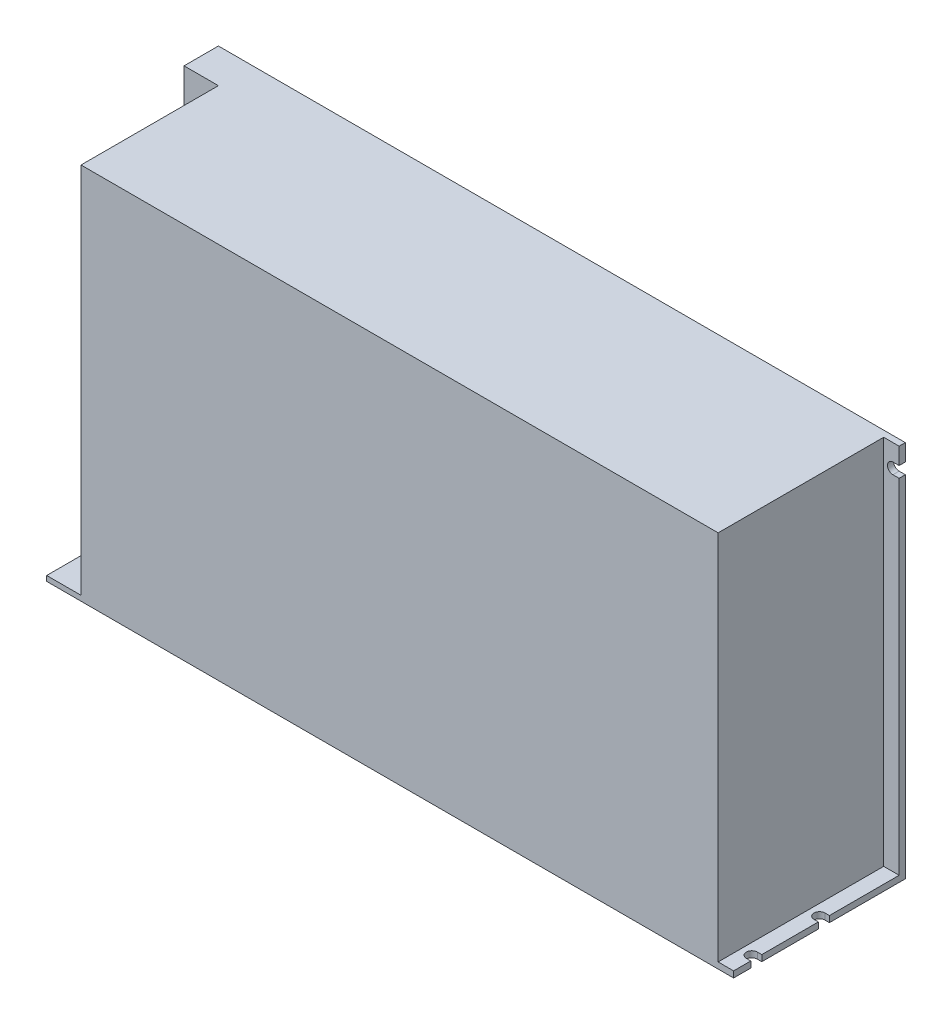
ISO-10303-21;
HEADER;
FILE_DESCRIPTION(('STEP AP214'),'2;1');
FILE_NAME('part.step','',(''),(''),'','','');
FILE_SCHEMA(('AUTOMOTIVE_DESIGN { 1 0 10303 214 1 1 1 1 }'));
ENDSEC;
DATA;
#1=APPLICATION_CONTEXT('core data for automotive mechanical design processes');
#2=APPLICATION_PROTOCOL_DEFINITION('international standard','automotive_design',2000,#1);
#3=PRODUCT_CONTEXT('',#1,'mechanical');
#4=PRODUCT('Part','Part','',(#3));
#5=PRODUCT_RELATED_PRODUCT_CATEGORY('part','',(#4));
#6=PRODUCT_DEFINITION_FORMATION('','',#4);
#7=PRODUCT_DEFINITION_CONTEXT('part definition',#1,'design');
#8=PRODUCT_DEFINITION('design','',#6,#7);
#9=PRODUCT_DEFINITION_SHAPE('','',#8);
#10=(LENGTH_UNIT() NAMED_UNIT(*) SI_UNIT(.MILLI.,.METRE.));
#11=(NAMED_UNIT(*) PLANE_ANGLE_UNIT() SI_UNIT($,.RADIAN.));
#12=(NAMED_UNIT(*) SI_UNIT($,.STERADIAN.) SOLID_ANGLE_UNIT());
#13=UNCERTAINTY_MEASURE_WITH_UNIT(LENGTH_MEASURE(1.E-05),#10,'distance_accuracy_value','');
#14=(GEOMETRIC_REPRESENTATION_CONTEXT(3) GLOBAL_UNCERTAINTY_ASSIGNED_CONTEXT((#13)) GLOBAL_UNIT_ASSIGNED_CONTEXT((#10,
#11,#12)) REPRESENTATION_CONTEXT('',''));
#15=CARTESIAN_POINT('',(0.,0.,0.));
#16=DIRECTION('',(0.,0.,1.));
#17=DIRECTION('',(1.,0.,0.));
#18=AXIS2_PLACEMENT_3D('',#15,#16,#17);
#19=CARTESIAN_POINT('',(77.9667757774141,60.842062193126,50.));
#20=DIRECTION('',(-1.,0.,0.));
#21=DIRECTION('',(0.,0.,1.));
#22=AXIS2_PLACEMENT_3D('',#19,#20,#21);
#23=PLANE('',#22);
#24=DIRECTION('',(0.,1.,0.));
#25=VECTOR('',#24,1.);
#26=CARTESIAN_POINT('',(77.9667757774141,-97.5675442915377,1.8));
#27=LINE('',#26,#25);
#28=CARTESIAN_POINT('',(77.9667757774141,55.942062193126,1.8));
#29=VERTEX_POINT('',#28);
#30=CARTESIAN_POINT('',(77.9667757774141,60.842062193126,1.8));
#31=VERTEX_POINT('',#30);
#32=EDGE_CURVE('E311',#29,#31,#27,.T.);
#33=ORIENTED_EDGE('',*,*,#32,.F.);
#34=DIRECTION('',(0.,0.,-1.));
#35=VECTOR('',#34,1.);
#36=CARTESIAN_POINT('',(77.9667757774141,55.942062193126,1.8));
#37=LINE('',#36,#35);
#38=CARTESIAN_POINT('',(77.9667757774141,55.942062193126,0.));
#39=VERTEX_POINT('',#38);
#40=EDGE_CURVE('E385',#29,#39,#37,.T.);
#41=ORIENTED_EDGE('',*,*,#40,.T.);
#42=DIRECTION('',(0.,1.,0.));
#43=VECTOR('',#42,1.);
#44=CARTESIAN_POINT('',(77.9667757774141,60.842062193126,0.));
#45=LINE('',#44,#43);
#46=CARTESIAN_POINT('',(77.9667757774141,60.842062193126,0.));
#47=VERTEX_POINT('',#46);
#48=EDGE_CURVE('E222',#39,#47,#45,.T.);
#49=ORIENTED_EDGE('',*,*,#48,.T.);
#50=DIRECTION('',(0.,0.,-1.));
#51=VECTOR('',#50,1.);
#52=CARTESIAN_POINT('',(77.9667757774141,60.842062193126,50.));
#53=LINE('',#52,#51);
#54=EDGE_CURVE('E241',#31,#47,#53,.T.);
#55=ORIENTED_EDGE('',*,*,#54,.F.);
#56=EDGE_LOOP('',(#33,#41,#49,#55));
#57=FACE_BOUND('',#56,.T.);
#58=ADVANCED_FACE('F31',(#57),#23,.F.);
#59=DIRECTION('',(0.,0.,-1.));
#60=VECTOR('',#59,1.);
#61=CARTESIAN_POINT('',(77.9667757774141,-49.157937806874,50.));
#62=LINE('',#61,#60);
#63=CARTESIAN_POINT('',(77.9667757774141,-49.157937806874,41.8));
#64=VERTEX_POINT('',#63);
#65=CARTESIAN_POINT('',(77.9667757774141,-49.157937806874,25.3));
#66=VERTEX_POINT('',#65);
#67=EDGE_CURVE('E248',#64,#66,#62,.T.);
#68=ORIENTED_EDGE('',*,*,#67,.T.);
#69=DIRECTION('',(0.,-1.,0.));
#70=VECTOR('',#69,1.);
#71=CARTESIAN_POINT('',(77.9667757774141,-39.157937806874,25.3));
#72=LINE('',#71,#70);
#73=CARTESIAN_POINT('',(77.9667757774141,-47.357937806874,25.3));
#74=VERTEX_POINT('',#73);
#75=EDGE_CURVE('E288',#74,#66,#72,.T.);
#76=ORIENTED_EDGE('',*,*,#75,.F.);
#77=DIRECTION('',(0.,0.,1.));
#78=VECTOR('',#77,1.);
#79=CARTESIAN_POINT('',(77.9667757774141,-47.357937806874,50.));
#80=LINE('',#79,#78);
#81=CARTESIAN_POINT('',(77.9667757774141,-47.357937806874,41.8));
#82=VERTEX_POINT('',#81);
#83=EDGE_CURVE('E293',#74,#82,#80,.T.);
#84=ORIENTED_EDGE('',*,*,#83,.T.);
#85=DIRECTION('',(0.,-1.,0.));
#86=VECTOR('',#85,1.);
#87=CARTESIAN_POINT('',(77.9667757774141,-39.157937806874,41.8));
#88=LINE('',#87,#86);
#89=EDGE_CURVE('E432',#82,#64,#88,.T.);
#90=ORIENTED_EDGE('',*,*,#89,.T.);
#91=EDGE_LOOP('',(#68,#76,#84,#90));
#92=FACE_BOUND('',#91,.T.);
#93=ADVANCED_FACE('F498',(#92),#23,.F.);
#94=CARTESIAN_POINT('',(77.9667757774141,-49.157937806874,50.));
#95=VERTEX_POINT('',#94);
#96=CARTESIAN_POINT('',(77.9667757774141,-49.157937806874,45.));
#97=VERTEX_POINT('',#96);
#98=EDGE_CURVE('E244',#95,#97,#62,.T.);
#99=ORIENTED_EDGE('',*,*,#98,.T.);
#100=DIRECTION('',(0.,-1.,0.));
#101=VECTOR('',#100,1.);
#102=CARTESIAN_POINT('',(77.9667757774141,-39.157937806874,45.));
#103=LINE('',#102,#101);
#104=CARTESIAN_POINT('',(77.9667757774141,-47.357937806874,45.));
#105=VERTEX_POINT('',#104);
#106=EDGE_CURVE('E430',#105,#97,#103,.T.);
#107=ORIENTED_EDGE('',*,*,#106,.F.);
#108=CARTESIAN_POINT('',(77.9667757774141,-47.357937806874,50.));
#109=VERTEX_POINT('',#108);
#110=EDGE_CURVE('E299',#105,#109,#80,.T.);
#111=ORIENTED_EDGE('',*,*,#110,.T.);
#112=DIRECTION('',(0.,1.,0.));
#113=VECTOR('',#112,1.);
#114=CARTESIAN_POINT('',(77.9667757774141,60.842062193126,50.));
#115=LINE('',#114,#113);
#116=EDGE_CURVE('E234',#95,#109,#115,.T.);
#117=ORIENTED_EDGE('',*,*,#116,.F.);
#118=EDGE_LOOP('',(#99,#107,#111,#117));
#119=FACE_BOUND('',#118,.T.);
#120=ADVANCED_FACE('F504',(#119),#23,.F.);
#121=CARTESIAN_POINT('',(-122.033224222586,-49.157937806874,0.));
#122=DIRECTION('',(0.,0.,1.));
#123=DIRECTION('',(1.,0.,0.));
#124=AXIS2_PLACEMENT_3D('',#121,#122,#123);
#125=PLANE('',#124);
#126=CARTESIAN_POINT('',(-118.533224222586,-41.157937806874,0.));
#127=DIRECTION('',(0.,0.,-1.));
#128=DIRECTION('',(-1.,0.,0.));
#129=AXIS2_PLACEMENT_3D('',#126,#127,#128);
#130=CIRCLE('',#129,1.60000000000001);
#131=CARTESIAN_POINT('',(-120.133224222586,-41.157937806874,0.));
#132=VERTEX_POINT('',#131);
#133=EDGE_CURVE('E624',#132,#132,#130,.T.);
#134=ORIENTED_EDGE('',*,*,#133,.F.);
#135=EDGE_LOOP('',(#134));
#136=FACE_BOUND('',#135,.T.);
#137=CARTESIAN_POINT('',(-60.5332242225859,-34.157937806874,0.));
#138=DIRECTION('',(0.,0.,1.));
#139=DIRECTION('',(1.,0.,0.));
#140=AXIS2_PLACEMENT_3D('',#137,#138,#139);
#141=CIRCLE('',#140,2.);
#142=CARTESIAN_POINT('',(-58.5332242225859,-34.157937806874,0.));
#143=VERTEX_POINT('',#142);
#144=EDGE_CURVE('E347',#143,#143,#141,.T.);
#145=ORIENTED_EDGE('',*,*,#144,.T.);
#146=EDGE_LOOP('',(#145));
#147=FACE_BOUND('',#146,.T.);
#148=CARTESIAN_POINT('',(-60.533224222586,50.842062193126,0.));
#149=DIRECTION('',(0.,0.,1.));
#150=DIRECTION('',(1.,0.,0.));
#151=AXIS2_PLACEMENT_3D('',#148,#149,#150);
#152=CIRCLE('',#151,2.);
#153=CARTESIAN_POINT('',(-58.533224222586,50.842062193126,0.));
#154=VERTEX_POINT('',#153);
#155=EDGE_CURVE('E359',#154,#154,#152,.T.);
#156=ORIENTED_EDGE('',*,*,#155,.T.);
#157=EDGE_LOOP('',(#156));
#158=FACE_BOUND('',#157,.T.);
#159=ORIENTED_EDGE('',*,*,#48,.F.);
#160=DIRECTION('',(1.,0.,0.));
#161=VECTOR('',#160,1.);
#162=CARTESIAN_POINT('',(77.9667757774141,55.942062193126,0.));
#163=LINE('',#162,#161);
#164=CARTESIAN_POINT('',(76.1667757774141,55.942062193126,0.));
#165=VERTEX_POINT('',#164);
#166=EDGE_CURVE('E629',#165,#39,#163,.T.);
#167=ORIENTED_EDGE('',*,*,#166,.F.);
#168=CARTESIAN_POINT('',(76.1667757774141,54.342062193126,0.));
#169=DIRECTION('',(0.,0.,-1.));
#170=DIRECTION('',(1.,0.,0.));
#171=AXIS2_PLACEMENT_3D('',#168,#169,#170);
#172=CIRCLE('',#171,1.6);
#173=CARTESIAN_POINT('',(76.1667757774141,52.742062193126,0.));
#174=VERTEX_POINT('',#173);
#175=EDGE_CURVE('E213',#174,#165,#172,.T.);
#176=ORIENTED_EDGE('',*,*,#175,.F.);
#177=DIRECTION('',(-1.,0.,0.));
#178=VECTOR('',#177,1.);
#179=CARTESIAN_POINT('',(77.9667757774141,52.742062193126,0.));
#180=LINE('',#179,#178);
#181=CARTESIAN_POINT('',(77.9667757774141,52.742062193126,0.));
#182=VERTEX_POINT('',#181);
#183=EDGE_CURVE('E194',#182,#174,#180,.T.);
#184=ORIENTED_EDGE('',*,*,#183,.F.);
#185=CARTESIAN_POINT('',(77.9667757774141,-49.157937806874,0.));
#186=VERTEX_POINT('',#185);
#187=EDGE_CURVE('E210',#186,#182,#45,.T.);
#188=ORIENTED_EDGE('',*,*,#187,.F.);
#189=DIRECTION('',(1.,0.,0.));
#190=VECTOR('',#189,1.);
#191=CARTESIAN_POINT('',(-122.033224222586,-49.157937806874,0.));
#192=LINE('',#191,#190);
#193=CARTESIAN_POINT('',(-122.033224222586,-49.157937806874,0.));
#194=VERTEX_POINT('',#193);
#195=EDGE_CURVE('E227',#194,#186,#192,.T.);
#196=ORIENTED_EDGE('',*,*,#195,.F.);
#197=DIRECTION('',(0.,-1.,0.));
#198=VECTOR('',#197,1.);
#199=CARTESIAN_POINT('',(-122.033224222586,60.842062193126,0.));
#200=LINE('',#199,#198);
#201=CARTESIAN_POINT('',(-122.033224222586,60.842062193126,0.));
#202=VERTEX_POINT('',#201);
#203=EDGE_CURVE('E364',#202,#194,#200,.T.);
#204=ORIENTED_EDGE('',*,*,#203,.F.);
#205=DIRECTION('',(-1.,0.,0.));
#206=VECTOR('',#205,1.);
#207=CARTESIAN_POINT('',(-122.033224222586,60.842062193126,0.));
#208=LINE('',#207,#206);
#209=EDGE_CURVE('E221',#47,#202,#208,.T.);
#210=ORIENTED_EDGE('',*,*,#209,.F.);
#211=EDGE_LOOP('',(#159,#167,#176,#184,#188,#196,#204,#210));
#212=FACE_BOUND('',#211,.T.);
#213=CARTESIAN_POINT('',(65.466775777414,50.842062193126,0.));
#214=DIRECTION('',(0.,0.,1.));
#215=DIRECTION('',(1.,0.,0.));
#216=AXIS2_PLACEMENT_3D('',#213,#214,#215);
#217=CIRCLE('',#216,2.);
#218=CARTESIAN_POINT('',(67.466775777414,50.842062193126,0.));
#219=VERTEX_POINT('',#218);
#220=EDGE_CURVE('E353',#219,#219,#217,.T.);
#221=ORIENTED_EDGE('',*,*,#220,.T.);
#222=EDGE_LOOP('',(#221));
#223=FACE_BOUND('',#222,.T.);
#224=CARTESIAN_POINT('',(65.4667757774141,-34.157937806874,0.));
#225=DIRECTION('',(0.,0.,1.));
#226=DIRECTION('',(1.,0.,0.));
#227=AXIS2_PLACEMENT_3D('',#224,#225,#226);
#228=CIRCLE('',#227,2.);
#229=CARTESIAN_POINT('',(67.4667757774141,-34.157937806874,0.));
#230=VERTEX_POINT('',#229);
#231=EDGE_CURVE('E338',#230,#230,#228,.T.);
#232=ORIENTED_EDGE('',*,*,#231,.T.);
#233=EDGE_LOOP('',(#232));
#234=FACE_BOUND('',#233,.T.);
#235=ADVANCED_FACE('F208',(#136,#147,#158,#212,#223,#234),#125,.F.);
#236=CARTESIAN_POINT('',(-122.033224222586,60.842062193126,50.));
#237=DIRECTION('',(1.,0.,0.));
#238=DIRECTION('',(0.,1.,0.));
#239=AXIS2_PLACEMENT_3D('',#236,#237,#238);
#240=PLANE('',#239);
#241=DIRECTION('',(0.,0.,1.));
#242=VECTOR('',#241,1.);
#243=CARTESIAN_POINT('',(-122.033224222586,-47.657937806874,10.));
#244=LINE('',#243,#242);
#245=CARTESIAN_POINT('',(-122.033224222586,-47.657937806874,1.8));
#246=VERTEX_POINT('',#245);
#247=CARTESIAN_POINT('',(-122.033224222586,-47.657937806874,50.));
#248=VERTEX_POINT('',#247);
#249=EDGE_CURVE('E334',#246,#248,#244,.T.);
#250=ORIENTED_EDGE('',*,*,#249,.F.);
#251=DIRECTION('',(0.,1.,0.));
#252=VECTOR('',#251,1.);
#253=CARTESIAN_POINT('',(-122.033224222586,-47.657937806874,1.8));
#254=LINE('',#253,#252);
#255=CARTESIAN_POINT('',(-122.033224222586,-37.657937806874,1.79999999999999));
#256=VERTEX_POINT('',#255);
#257=EDGE_CURVE('E398',#246,#256,#254,.T.);
#258=ORIENTED_EDGE('',*,*,#257,.T.);
#259=DIRECTION('',(0.,0.,1.));
#260=VECTOR('',#259,1.);
#261=CARTESIAN_POINT('',(-122.033224222586,-37.657937806874,-14.142135623731));
#262=LINE('',#261,#260);
#263=CARTESIAN_POINT('',(-122.033224222586,-37.657937806874,10.));
#264=VERTEX_POINT('',#263);
#265=EDGE_CURVE('E402',#256,#264,#262,.T.);
#266=ORIENTED_EDGE('',*,*,#265,.T.);
#267=DIRECTION('',(0.,-1.,0.));
#268=VECTOR('',#267,1.);
#269=CARTESIAN_POINT('',(-122.033224222586,60.842062193126,10.));
#270=LINE('',#269,#268);
#271=CARTESIAN_POINT('',(-122.033224222586,60.842062193126,10.));
#272=VERTEX_POINT('',#271);
#273=EDGE_CURVE('E327',#272,#264,#270,.T.);
#274=ORIENTED_EDGE('',*,*,#273,.F.);
#275=DIRECTION('',(0.,0.,-1.));
#276=VECTOR('',#275,1.);
#277=CARTESIAN_POINT('',(-122.033224222586,60.842062193126,50.));
#278=LINE('',#277,#276);
#279=EDGE_CURVE('E239',#272,#202,#278,.T.);
#280=ORIENTED_EDGE('',*,*,#279,.T.);
#281=ORIENTED_EDGE('',*,*,#203,.T.);
#282=DIRECTION('',(0.,0.,-1.));
#283=VECTOR('',#282,1.);
#284=CARTESIAN_POINT('',(-122.033224222586,-49.157937806874,50.));
#285=LINE('',#284,#283);
#286=CARTESIAN_POINT('',(-122.033224222586,-49.157937806874,50.));
#287=VERTEX_POINT('',#286);
#288=EDGE_CURVE('E247',#287,#194,#285,.T.);
#289=ORIENTED_EDGE('',*,*,#288,.F.);
#290=DIRECTION('',(0.,-1.,0.));
#291=VECTOR('',#290,1.);
#292=CARTESIAN_POINT('',(-122.033224222586,60.842062193126,50.));
#293=LINE('',#292,#291);
#294=EDGE_CURVE('E225',#248,#287,#293,.T.);
#295=ORIENTED_EDGE('',*,*,#294,.F.);
#296=EDGE_LOOP('',(#250,#258,#266,#274,#280,#281,#289,#295));
#297=FACE_BOUND('',#296,.T.);
#298=ADVANCED_FACE('F33',(#297),#240,.F.);
#299=CARTESIAN_POINT('',(-122.033224222586,-49.157937806874,50.));
#300=DIRECTION('',(0.,1.,0.));
#301=DIRECTION('',(0.,0.,1.));
#302=AXIS2_PLACEMENT_3D('',#299,#300,#301);
#303=PLANE('',#302);
#304=CARTESIAN_POINT('',(-116.033224222586,-49.157937806874,33.));
#305=DIRECTION('',(0.,-1.,0.));
#306=DIRECTION('',(0.,0.,-1.));
#307=AXIS2_PLACEMENT_3D('',#304,#305,#306);
#308=CIRCLE('',#307,1.60000000000001);
#309=CARTESIAN_POINT('',(-116.033224222586,-49.157937806874,31.4));
#310=VERTEX_POINT('',#309);
#311=EDGE_CURVE('E261',#310,#310,#308,.T.);
#312=ORIENTED_EDGE('',*,*,#311,.F.);
#313=EDGE_LOOP('',(#312));
#314=FACE_BOUND('',#313,.T.);
#315=CARTESIAN_POINT('',(56.9667757774141,-49.157937806874,38.));
#316=DIRECTION('',(0.,-1.,0.));
#317=DIRECTION('',(0.,0.,-1.));
#318=AXIS2_PLACEMENT_3D('',#315,#316,#317);
#319=CIRCLE('',#318,1.5);
#320=CARTESIAN_POINT('',(56.9667757774141,-49.157937806874,36.5));
#321=VERTEX_POINT('',#320);
#322=EDGE_CURVE('E260',#321,#321,#319,.T.);
#323=ORIENTED_EDGE('',*,*,#322,.F.);
#324=EDGE_LOOP('',(#323));
#325=FACE_BOUND('',#324,.T.);
#326=CARTESIAN_POINT('',(56.9667757774141,-49.157937806874,13.));
#327=DIRECTION('',(0.,-1.,0.));
#328=DIRECTION('',(0.,0.,-1.));
#329=AXIS2_PLACEMENT_3D('',#326,#327,#328);
#330=CIRCLE('',#329,1.5);
#331=CARTESIAN_POINT('',(56.9667757774141,-49.157937806874,11.5));
#332=VERTEX_POINT('',#331);
#333=EDGE_CURVE('E444',#332,#332,#330,.T.);
#334=ORIENTED_EDGE('',*,*,#333,.F.);
#335=EDGE_LOOP('',(#334));
#336=FACE_BOUND('',#335,.T.);
#337=CARTESIAN_POINT('',(-116.033224222586,-49.157937806874,13.));
#338=DIRECTION('',(0.,-1.,0.));
#339=DIRECTION('',(0.,0.,-1.));
#340=AXIS2_PLACEMENT_3D('',#337,#338,#339);
#341=CIRCLE('',#340,1.5);
#342=CARTESIAN_POINT('',(-116.033224222586,-49.157937806874,11.5));
#343=VERTEX_POINT('',#342);
#344=EDGE_CURVE('E256',#343,#343,#341,.T.);
#345=ORIENTED_EDGE('',*,*,#344,.F.);
#346=EDGE_LOOP('',(#345));
#347=FACE_BOUND('',#346,.T.);
#348=CARTESIAN_POINT('',(76.6667757774141,-49.157937806874,23.7));
#349=DIRECTION('',(0.,-1.,0.));
#350=DIRECTION('',(0.,0.,1.));
#351=AXIS2_PLACEMENT_3D('',#348,#349,#350);
#352=CIRCLE('',#351,1.59999999999999);
#353=CARTESIAN_POINT('',(76.6667757774141,-49.157937806874,25.3));
#354=VERTEX_POINT('',#353);
#355=CARTESIAN_POINT('',(76.6667757774141,-49.157937806874,22.1));
#356=VERTEX_POINT('',#355);
#357=EDGE_CURVE('E413',#354,#356,#352,.T.);
#358=ORIENTED_EDGE('',*,*,#357,.F.);
#359=DIRECTION('',(-1.,0.,0.));
#360=VECTOR('',#359,1.);
#361=CARTESIAN_POINT('',(77.9667757774141,-49.157937806874,25.3));
#362=LINE('',#361,#360);
#363=EDGE_CURVE('E285',#66,#354,#362,.T.);
#364=ORIENTED_EDGE('',*,*,#363,.F.);
#365=ORIENTED_EDGE('',*,*,#67,.F.);
#366=DIRECTION('',(1.,0.,0.));
#367=VECTOR('',#366,1.);
#368=CARTESIAN_POINT('',(77.9667757774141,-49.157937806874,41.8));
#369=LINE('',#368,#367);
#370=CARTESIAN_POINT('',(76.6667757774141,-49.157937806874,41.8));
#371=VERTEX_POINT('',#370);
#372=EDGE_CURVE('E427',#371,#64,#369,.T.);
#373=ORIENTED_EDGE('',*,*,#372,.F.);
#374=CARTESIAN_POINT('',(76.6667757774141,-49.157937806874,43.4));
#375=DIRECTION('',(0.,-1.,0.));
#376=DIRECTION('',(0.,0.,-1.));
#377=AXIS2_PLACEMENT_3D('',#374,#375,#376);
#378=CIRCLE('',#377,1.6);
#379=CARTESIAN_POINT('',(76.6667757774141,-49.157937806874,45.));
#380=VERTEX_POINT('',#379);
#381=EDGE_CURVE('E424',#380,#371,#378,.T.);
#382=ORIENTED_EDGE('',*,*,#381,.F.);
#383=DIRECTION('',(-1.,0.,0.));
#384=VECTOR('',#383,1.);
#385=CARTESIAN_POINT('',(77.9667757774141,-49.157937806874,45.));
#386=LINE('',#385,#384);
#387=EDGE_CURVE('E287',#97,#380,#386,.T.);
#388=ORIENTED_EDGE('',*,*,#387,.F.);
#389=ORIENTED_EDGE('',*,*,#98,.F.);
#390=DIRECTION('',(1.,0.,0.));
#391=VECTOR('',#390,1.);
#392=CARTESIAN_POINT('',(-122.033224222586,-49.157937806874,50.));
#393=LINE('',#392,#391);
#394=EDGE_CURVE('E232',#287,#95,#393,.T.);
#395=ORIENTED_EDGE('',*,*,#394,.F.);
#396=ORIENTED_EDGE('',*,*,#288,.T.);
#397=ORIENTED_EDGE('',*,*,#195,.T.);
#398=CARTESIAN_POINT('',(77.9667757774141,-49.157937806874,22.1));
#399=VERTEX_POINT('',#398);
#400=EDGE_CURVE('E219',#399,#186,#62,.T.);
#401=ORIENTED_EDGE('',*,*,#400,.F.);
#402=DIRECTION('',(1.,0.,0.));
#403=VECTOR('',#402,1.);
#404=CARTESIAN_POINT('',(77.9667757774141,-49.157937806874,22.1));
#405=LINE('',#404,#403);
#406=EDGE_CURVE('E415',#356,#399,#405,.T.);
#407=ORIENTED_EDGE('',*,*,#406,.F.);
#408=EDGE_LOOP('',(#358,#364,#365,#373,#382,#388,#389,#395,#396,#397,#401,#407));
#409=FACE_BOUND('',#408,.T.);
#410=ADVANCED_FACE('F370',(#314,#325,#336,#347,#409),#303,.F.);
#411=ORIENTED_EDGE('',*,*,#187,.T.);
#412=DIRECTION('',(0.,0.,-1.));
#413=VECTOR('',#412,1.);
#414=CARTESIAN_POINT('',(77.9667757774141,52.742062193126,1.8));
#415=LINE('',#414,#413);
#416=CARTESIAN_POINT('',(77.9667757774141,52.742062193126,1.8));
#417=VERTEX_POINT('',#416);
#418=EDGE_CURVE('E191',#417,#182,#415,.T.);
#419=ORIENTED_EDGE('',*,*,#418,.F.);
#420=CARTESIAN_POINT('',(77.9667757774141,-47.357937806874,1.8));
#421=VERTEX_POINT('',#420);
#422=EDGE_CURVE('E318',#421,#417,#27,.T.);
#423=ORIENTED_EDGE('',*,*,#422,.F.);
#424=CARTESIAN_POINT('',(77.9667757774141,-47.357937806874,22.1));
#425=VERTEX_POINT('',#424);
#426=EDGE_CURVE('E298',#421,#425,#80,.T.);
#427=ORIENTED_EDGE('',*,*,#426,.T.);
#428=DIRECTION('',(0.,-1.,0.));
#429=VECTOR('',#428,1.);
#430=CARTESIAN_POINT('',(77.9667757774141,-39.157937806874,22.1));
#431=LINE('',#430,#429);
#432=EDGE_CURVE('E419',#425,#399,#431,.T.);
#433=ORIENTED_EDGE('',*,*,#432,.T.);
#434=ORIENTED_EDGE('',*,*,#400,.T.);
#435=EDGE_LOOP('',(#411,#419,#423,#427,#433,#434));
#436=FACE_BOUND('',#435,.T.);
#437=ADVANCED_FACE('F216',(#436),#23,.F.);
#438=CARTESIAN_POINT('',(-122.033224222586,60.842062193126,50.));
#439=DIRECTION('',(0.,-1.,0.));
#440=DIRECTION('',(0.,0.,-1.));
#441=AXIS2_PLACEMENT_3D('',#438,#439,#440);
#442=PLANE('',#441);
#443=DIRECTION('',(-1.,0.,0.));
#444=VECTOR('',#443,1.);
#445=CARTESIAN_POINT('',(-122.033224222586,60.842062193126,50.));
#446=LINE('',#445,#444);
#447=CARTESIAN_POINT('',(73.4667757774141,60.842062193126,50.));
#448=VERTEX_POINT('',#447);
#449=CARTESIAN_POINT('',(-112.033224222586,60.842062193126,50.));
#450=VERTEX_POINT('',#449);
#451=EDGE_CURVE('E237',#448,#450,#446,.T.);
#452=ORIENTED_EDGE('',*,*,#451,.F.);
#453=DIRECTION('',(0.,0.,1.));
#454=VECTOR('',#453,1.);
#455=CARTESIAN_POINT('',(73.4667757774141,60.842062193126,50.));
#456=LINE('',#455,#454);
#457=CARTESIAN_POINT('',(73.4667757774141,60.842062193126,1.8));
#458=VERTEX_POINT('',#457);
#459=EDGE_CURVE('E309',#458,#448,#456,.T.);
#460=ORIENTED_EDGE('',*,*,#459,.F.);
#461=DIRECTION('',(-1.,0.,0.));
#462=VECTOR('',#461,1.);
#463=CARTESIAN_POINT('',(77.9667757774141,60.842062193126,1.8));
#464=LINE('',#463,#462);
#465=EDGE_CURVE('E255',#31,#458,#464,.T.);
#466=ORIENTED_EDGE('',*,*,#465,.F.);
#467=ORIENTED_EDGE('',*,*,#54,.T.);
#468=ORIENTED_EDGE('',*,*,#209,.T.);
#469=ORIENTED_EDGE('',*,*,#279,.F.);
#470=DIRECTION('',(-1.,0.,0.));
#471=VECTOR('',#470,1.);
#472=CARTESIAN_POINT('',(-122.033224222586,60.842062193126,10.));
#473=LINE('',#472,#471);
#474=CARTESIAN_POINT('',(-112.033224222586,60.842062193126,10.));
#475=VERTEX_POINT('',#474);
#476=EDGE_CURVE('E332',#475,#272,#473,.T.);
#477=ORIENTED_EDGE('',*,*,#476,.F.);
#478=DIRECTION('',(0.,0.,1.));
#479=VECTOR('',#478,1.);
#480=CARTESIAN_POINT('',(-112.033224222586,60.842062193126,10.));
#481=LINE('',#480,#479);
#482=EDGE_CURVE('E335',#475,#450,#481,.T.);
#483=ORIENTED_EDGE('',*,*,#482,.T.);
#484=EDGE_LOOP('',(#452,#460,#466,#467,#468,#469,#477,#483));
#485=FACE_BOUND('',#484,.T.);
#486=ADVANCED_FACE('F377',(#485),#442,.F.);
#487=CARTESIAN_POINT('',(-122.033224222586,-49.157937806874,50.));
#488=DIRECTION('',(0.,0.,1.));
#489=DIRECTION('',(1.,0.,0.));
#490=AXIS2_PLACEMENT_3D('',#487,#488,#489);
#491=PLANE('',#490);
#492=DIRECTION('',(0.,1.,0.));
#493=VECTOR('',#492,1.);
#494=CARTESIAN_POINT('',(73.4667757774141,-97.5675442915377,50.));
#495=LINE('',#494,#493);
#496=CARTESIAN_POINT('',(73.466775777414,-47.357937806874,50.));
#497=VERTEX_POINT('',#496);
#498=EDGE_CURVE('E312',#497,#448,#495,.T.);
#499=ORIENTED_EDGE('',*,*,#498,.T.);
#500=ORIENTED_EDGE('',*,*,#451,.T.);
#501=DIRECTION('',(0.,1.,0.));
#502=VECTOR('',#501,1.);
#503=CARTESIAN_POINT('',(-112.033224222586,60.842062193126,50.));
#504=LINE('',#503,#502);
#505=CARTESIAN_POINT('',(-112.033224222586,-47.657937806874,50.));
#506=VERTEX_POINT('',#505);
#507=EDGE_CURVE('E324',#506,#450,#504,.T.);
#508=ORIENTED_EDGE('',*,*,#507,.F.);
#509=DIRECTION('',(1.,0.,0.));
#510=VECTOR('',#509,1.);
#511=CARTESIAN_POINT('',(-122.033224222586,-47.657937806874,50.));
#512=LINE('',#511,#510);
#513=EDGE_CURVE('E321',#248,#506,#512,.T.);
#514=ORIENTED_EDGE('',*,*,#513,.F.);
#515=ORIENTED_EDGE('',*,*,#294,.T.);
#516=ORIENTED_EDGE('',*,*,#394,.T.);
#517=ORIENTED_EDGE('',*,*,#116,.T.);
#518=DIRECTION('',(-1.,0.,0.));
#519=VECTOR('',#518,1.);
#520=CARTESIAN_POINT('',(77.9667757774141,-47.357937806874,50.));
#521=LINE('',#520,#519);
#522=EDGE_CURVE('E303',#109,#497,#521,.T.);
#523=ORIENTED_EDGE('',*,*,#522,.T.);
#524=EDGE_LOOP('',(#499,#500,#508,#514,#515,#516,#517,#523));
#525=FACE_BOUND('',#524,.T.);
#526=ADVANCED_FACE('F457',(#525),#491,.T.);
#527=CARTESIAN_POINT('',(-60.533224222586,50.842062193126,10.));
#528=DIRECTION('',(0.,0.,-1.));
#529=DIRECTION('',(-1.,0.,0.));
#530=AXIS2_PLACEMENT_3D('',#527,#528,#529);
#531=CYLINDRICAL_SURFACE('',#530,2.);
#532=CARTESIAN_POINT('',(-60.533224222586,50.842062193126,10.));
#533=DIRECTION('',(0.,0.,1.));
#534=DIRECTION('',(1.,0.,0.));
#535=AXIS2_PLACEMENT_3D('',#532,#533,#534);
#536=CIRCLE('',#535,2.);
#537=CARTESIAN_POINT('',(-58.533224222586,50.842062193126,10.));
#538=VERTEX_POINT('',#537);
#539=EDGE_CURVE('E362',#538,#538,#536,.T.);
#540=ORIENTED_EDGE('',*,*,#539,.T.);
#541=EDGE_LOOP('',(#540));
#542=FACE_BOUND('',#541,.T.);
#543=ORIENTED_EDGE('',*,*,#155,.F.);
#544=EDGE_LOOP('',(#543));
#545=FACE_BOUND('',#544,.T.);
#546=ADVANCED_FACE('F636',(#542,#545),#531,.F.);
#547=CARTESIAN_POINT('',(-60.533224222586,50.842062193126,10.));
#548=DIRECTION('',(0.,0.,1.));
#549=DIRECTION('',(1.,0.,0.));
#550=AXIS2_PLACEMENT_3D('',#547,#548,#549);
#551=PLANE('',#550);
#552=ORIENTED_EDGE('',*,*,#539,.F.);
#553=EDGE_LOOP('',(#552));
#554=FACE_BOUND('',#553,.T.);
#555=ADVANCED_FACE('F638',(#554),#551,.F.);
#556=CARTESIAN_POINT('',(65.466775777414,50.842062193126,10.));
#557=DIRECTION('',(0.,0.,-1.));
#558=DIRECTION('',(-1.,0.,0.));
#559=AXIS2_PLACEMENT_3D('',#556,#557,#558);
#560=CYLINDRICAL_SURFACE('',#559,2.);
#561=CARTESIAN_POINT('',(65.466775777414,50.842062193126,10.));
#562=DIRECTION('',(0.,0.,1.));
#563=DIRECTION('',(1.,0.,0.));
#564=AXIS2_PLACEMENT_3D('',#561,#562,#563);
#565=CIRCLE('',#564,2.);
#566=CARTESIAN_POINT('',(67.466775777414,50.842062193126,10.));
#567=VERTEX_POINT('',#566);
#568=EDGE_CURVE('E356',#567,#567,#565,.T.);
#569=ORIENTED_EDGE('',*,*,#568,.T.);
#570=EDGE_LOOP('',(#569));
#571=FACE_BOUND('',#570,.T.);
#572=ORIENTED_EDGE('',*,*,#220,.F.);
#573=EDGE_LOOP('',(#572));
#574=FACE_BOUND('',#573,.T.);
#575=ADVANCED_FACE('F644',(#571,#574),#560,.F.);
#576=CARTESIAN_POINT('',(65.466775777414,50.842062193126,10.));
#577=DIRECTION('',(0.,0.,1.));
#578=DIRECTION('',(1.,0.,0.));
#579=AXIS2_PLACEMENT_3D('',#576,#577,#578);
#580=PLANE('',#579);
#581=ORIENTED_EDGE('',*,*,#568,.F.);
#582=EDGE_LOOP('',(#581));
#583=FACE_BOUND('',#582,.T.);
#584=ADVANCED_FACE('F652',(#583),#580,.F.);
#585=CARTESIAN_POINT('',(-60.5332242225859,-34.157937806874,10.));
#586=DIRECTION('',(0.,0.,-1.));
#587=DIRECTION('',(-1.,0.,0.));
#588=AXIS2_PLACEMENT_3D('',#585,#586,#587);
#589=CYLINDRICAL_SURFACE('',#588,2.);
#590=CARTESIAN_POINT('',(-60.5332242225859,-34.157937806874,10.));
#591=DIRECTION('',(0.,0.,1.));
#592=DIRECTION('',(1.,0.,0.));
#593=AXIS2_PLACEMENT_3D('',#590,#591,#592);
#594=CIRCLE('',#593,2.);
#595=CARTESIAN_POINT('',(-58.5332242225859,-34.157937806874,10.));
#596=VERTEX_POINT('',#595);
#597=EDGE_CURVE('E350',#596,#596,#594,.T.);
#598=ORIENTED_EDGE('',*,*,#597,.T.);
#599=EDGE_LOOP('',(#598));
#600=FACE_BOUND('',#599,.T.);
#601=ORIENTED_EDGE('',*,*,#144,.F.);
#602=EDGE_LOOP('',(#601));
#603=FACE_BOUND('',#602,.T.);
#604=ADVANCED_FACE('F656',(#600,#603),#589,.F.);
#605=CARTESIAN_POINT('',(-60.5332242225859,-34.157937806874,10.));
#606=DIRECTION('',(0.,0.,1.));
#607=DIRECTION('',(1.,0.,0.));
#608=AXIS2_PLACEMENT_3D('',#605,#606,#607);
#609=PLANE('',#608);
#610=ORIENTED_EDGE('',*,*,#597,.F.);
#611=EDGE_LOOP('',(#610));
#612=FACE_BOUND('',#611,.T.);
#613=ADVANCED_FACE('F660',(#612),#609,.F.);
#614=CARTESIAN_POINT('',(65.4667757774141,-34.157937806874,10.));
#615=DIRECTION('',(0.,0.,-1.));
#616=DIRECTION('',(-1.,0.,0.));
#617=AXIS2_PLACEMENT_3D('',#614,#615,#616);
#618=CYLINDRICAL_SURFACE('',#617,2.);
#619=CARTESIAN_POINT('',(65.4667757774141,-34.157937806874,10.));
#620=DIRECTION('',(0.,0.,1.));
#621=DIRECTION('',(1.,0.,0.));
#622=AXIS2_PLACEMENT_3D('',#619,#620,#621);
#623=CIRCLE('',#622,2.);
#624=CARTESIAN_POINT('',(67.4667757774141,-34.157937806874,10.));
#625=VERTEX_POINT('',#624);
#626=EDGE_CURVE('E344',#625,#625,#623,.T.);
#627=ORIENTED_EDGE('',*,*,#626,.T.);
#628=EDGE_LOOP('',(#627));
#629=FACE_BOUND('',#628,.T.);
#630=ORIENTED_EDGE('',*,*,#231,.F.);
#631=EDGE_LOOP('',(#630));
#632=FACE_BOUND('',#631,.T.);
#633=ADVANCED_FACE('F664',(#629,#632),#618,.F.);
#634=CARTESIAN_POINT('',(65.4667757774141,-34.157937806874,10.));
#635=DIRECTION('',(0.,0.,1.));
#636=DIRECTION('',(1.,0.,0.));
#637=AXIS2_PLACEMENT_3D('',#634,#635,#636);
#638=PLANE('',#637);
#639=ORIENTED_EDGE('',*,*,#626,.F.);
#640=EDGE_LOOP('',(#639));
#641=FACE_BOUND('',#640,.T.);
#642=ADVANCED_FACE('F668',(#641),#638,.F.);
#643=CARTESIAN_POINT('',(-112.033224222586,60.842062193126,10.));
#644=DIRECTION('',(1.,0.,0.));
#645=DIRECTION('',(0.,1.,0.));
#646=AXIS2_PLACEMENT_3D('',#643,#644,#645);
#647=PLANE('',#646);
#648=ORIENTED_EDGE('',*,*,#507,.T.);
#649=ORIENTED_EDGE('',*,*,#482,.F.);
#650=DIRECTION('',(0.,1.,0.));
#651=VECTOR('',#650,1.);
#652=CARTESIAN_POINT('',(-112.033224222586,60.842062193126,10.));
#653=LINE('',#652,#651);
#654=CARTESIAN_POINT('',(-112.033224222586,-37.657937806874,10.));
#655=VERTEX_POINT('',#654);
#656=EDGE_CURVE('E330',#655,#475,#653,.T.);
#657=ORIENTED_EDGE('',*,*,#656,.F.);
#658=DIRECTION('',(0.,0.,1.));
#659=VECTOR('',#658,1.);
#660=CARTESIAN_POINT('',(-112.033224222586,-37.657937806874,-14.142135623731));
#661=LINE('',#660,#659);
#662=CARTESIAN_POINT('',(-112.033224222586,-37.657937806874,1.8));
#663=VERTEX_POINT('',#662);
#664=EDGE_CURVE('E54',#663,#655,#661,.T.);
#665=ORIENTED_EDGE('',*,*,#664,.F.);
#666=DIRECTION('',(0.,-1.,0.));
#667=VECTOR('',#666,1.);
#668=CARTESIAN_POINT('',(-112.033224222586,-47.657937806874,1.8));
#669=LINE('',#668,#667);
#670=CARTESIAN_POINT('',(-112.033224222586,-47.657937806874,1.8));
#671=VERTEX_POINT('',#670);
#672=EDGE_CURVE('E405',#663,#671,#669,.T.);
#673=ORIENTED_EDGE('',*,*,#672,.T.);
#674=DIRECTION('',(0.,0.,1.));
#675=VECTOR('',#674,1.);
#676=CARTESIAN_POINT('',(-112.033224222586,-47.657937806874,10.));
#677=LINE('',#676,#675);
#678=EDGE_CURVE('E339',#671,#506,#677,.T.);
#679=ORIENTED_EDGE('',*,*,#678,.T.);
#680=EDGE_LOOP('',(#648,#649,#657,#665,#673,#679));
#681=FACE_BOUND('',#680,.T.);
#682=ADVANCED_FACE('F470',(#681),#647,.F.);
#683=CARTESIAN_POINT('',(-122.033224222586,-47.657937806874,10.));
#684=DIRECTION('',(0.,-1.,0.));
#685=DIRECTION('',(0.,0.,-1.));
#686=AXIS2_PLACEMENT_3D('',#683,#684,#685);
#687=PLANE('',#686);
#688=CARTESIAN_POINT('',(-116.033224222586,-47.657937806874,33.));
#689=DIRECTION('',(0.,-1.,0.));
#690=DIRECTION('',(0.,0.,-1.));
#691=AXIS2_PLACEMENT_3D('',#688,#689,#690);
#692=CIRCLE('',#691,1.60000000000001);
#693=CARTESIAN_POINT('',(-116.033224222586,-47.657937806874,31.4));
#694=VERTEX_POINT('',#693);
#695=EDGE_CURVE('E257',#694,#694,#692,.T.);
#696=ORIENTED_EDGE('',*,*,#695,.T.);
#697=EDGE_LOOP('',(#696));
#698=FACE_BOUND('',#697,.T.);
#699=CARTESIAN_POINT('',(-116.033224222586,-47.657937806874,13.));
#700=DIRECTION('',(0.,-1.,0.));
#701=DIRECTION('',(0.,0.,-1.));
#702=AXIS2_PLACEMENT_3D('',#699,#700,#701);
#703=CIRCLE('',#702,1.5);
#704=CARTESIAN_POINT('',(-116.033224222586,-47.657937806874,11.5));
#705=VERTEX_POINT('',#704);
#706=EDGE_CURVE('E252',#705,#705,#703,.T.);
#707=ORIENTED_EDGE('',*,*,#706,.T.);
#708=EDGE_LOOP('',(#707));
#709=FACE_BOUND('',#708,.T.);
#710=ORIENTED_EDGE('',*,*,#513,.T.);
#711=ORIENTED_EDGE('',*,*,#678,.F.);
#712=DIRECTION('',(-1.,0.,0.));
#713=VECTOR('',#712,1.);
#714=CARTESIAN_POINT('',(-112.033224222586,-47.657937806874,1.8));
#715=LINE('',#714,#713);
#716=EDGE_CURVE('E401',#671,#246,#715,.T.);
#717=ORIENTED_EDGE('',*,*,#716,.T.);
#718=ORIENTED_EDGE('',*,*,#249,.T.);
#719=EDGE_LOOP('',(#710,#711,#717,#718));
#720=FACE_BOUND('',#719,.T.);
#721=ADVANCED_FACE('F475',(#698,#709,#720),#687,.F.);
#722=CARTESIAN_POINT('',(-122.033224222586,-47.657937806874,10.));
#723=DIRECTION('',(0.,0.,1.));
#724=DIRECTION('',(1.,0.,0.));
#725=AXIS2_PLACEMENT_3D('',#722,#723,#724);
#726=PLANE('',#725);
#727=DIRECTION('',(-1.,0.,0.));
#728=VECTOR('',#727,1.);
#729=CARTESIAN_POINT('',(-112.033224222586,-37.657937806874,10.));
#730=LINE('',#729,#728);
#731=EDGE_CURVE('E389',#655,#264,#730,.T.);
#732=ORIENTED_EDGE('',*,*,#731,.F.);
#733=ORIENTED_EDGE('',*,*,#656,.T.);
#734=ORIENTED_EDGE('',*,*,#476,.T.);
#735=ORIENTED_EDGE('',*,*,#273,.T.);
#736=EDGE_LOOP('',(#732,#733,#734,#735));
#737=FACE_BOUND('',#736,.T.);
#738=ADVANCED_FACE('F484',(#737),#726,.T.);
#739=CARTESIAN_POINT('',(73.4667757774141,-97.5675442915377,50.));
#740=DIRECTION('',(-1.,0.,0.));
#741=DIRECTION('',(0.,0.,1.));
#742=AXIS2_PLACEMENT_3D('',#739,#740,#741);
#743=PLANE('',#742);
#744=DIRECTION('',(0.,0.,-1.));
#745=VECTOR('',#744,1.);
#746=CARTESIAN_POINT('',(73.4667757774141,-47.357937806874,50.));
#747=LINE('',#746,#745);
#748=CARTESIAN_POINT('',(73.4667757774141,-47.357937806874,1.8));
#749=VERTEX_POINT('',#748);
#750=EDGE_CURVE('E315',#497,#749,#747,.T.);
#751=ORIENTED_EDGE('',*,*,#750,.T.);
#752=DIRECTION('',(0.,1.,0.));
#753=VECTOR('',#752,1.);
#754=CARTESIAN_POINT('',(73.4667757774141,-97.5675442915377,1.8));
#755=LINE('',#754,#753);
#756=EDGE_CURVE('E316',#749,#458,#755,.T.);
#757=ORIENTED_EDGE('',*,*,#756,.T.);
#758=ORIENTED_EDGE('',*,*,#459,.T.);
#759=ORIENTED_EDGE('',*,*,#498,.F.);
#760=EDGE_LOOP('',(#751,#757,#758,#759));
#761=FACE_BOUND('',#760,.T.);
#762=ADVANCED_FACE('F465',(#761),#743,.F.);
#763=CARTESIAN_POINT('',(77.9667757774141,-97.5675442915377,1.8));
#764=DIRECTION('',(0.,0.,-1.));
#765=DIRECTION('',(-1.,0.,0.));
#766=AXIS2_PLACEMENT_3D('',#763,#764,#765);
#767=PLANE('',#766);
#768=CARTESIAN_POINT('',(76.1667757774141,54.342062193126,1.8));
#769=DIRECTION('',(0.,0.,-1.));
#770=DIRECTION('',(1.,0.,0.));
#771=AXIS2_PLACEMENT_3D('',#768,#769,#770);
#772=CIRCLE('',#771,1.6);
#773=CARTESIAN_POINT('',(76.1667757774141,52.742062193126,1.8));
#774=VERTEX_POINT('',#773);
#775=CARTESIAN_POINT('',(76.1667757774141,55.942062193126,1.8));
#776=VERTEX_POINT('',#775);
#777=EDGE_CURVE('E46',#774,#776,#772,.T.);
#778=ORIENTED_EDGE('',*,*,#777,.T.);
#779=DIRECTION('',(1.,0.,0.));
#780=VECTOR('',#779,1.);
#781=CARTESIAN_POINT('',(77.9667757774141,55.942062193126,1.8));
#782=LINE('',#781,#780);
#783=EDGE_CURVE('E203',#776,#29,#782,.T.);
#784=ORIENTED_EDGE('',*,*,#783,.T.);
#785=ORIENTED_EDGE('',*,*,#32,.T.);
#786=ORIENTED_EDGE('',*,*,#465,.T.);
#787=ORIENTED_EDGE('',*,*,#756,.F.);
#788=DIRECTION('',(1.,0.,0.));
#789=VECTOR('',#788,1.);
#790=CARTESIAN_POINT('',(77.9667757774141,-47.357937806874,1.8));
#791=LINE('',#790,#789);
#792=EDGE_CURVE('E302',#749,#421,#791,.T.);
#793=ORIENTED_EDGE('',*,*,#792,.T.);
#794=ORIENTED_EDGE('',*,*,#422,.T.);
#795=DIRECTION('',(-1.,0.,0.));
#796=VECTOR('',#795,1.);
#797=CARTESIAN_POINT('',(77.9667757774141,52.742062193126,1.8));
#798=LINE('',#797,#796);
#799=EDGE_CURVE('E197',#417,#774,#798,.T.);
#800=ORIENTED_EDGE('',*,*,#799,.T.);
#801=EDGE_LOOP('',(#778,#784,#785,#786,#787,#793,#794,#800));
#802=FACE_BOUND('',#801,.T.);
#803=ADVANCED_FACE('F464',(#802),#767,.F.);
#804=CARTESIAN_POINT('',(-122.033224222586,-47.357937806874,50.));
#805=DIRECTION('',(0.,1.,0.));
#806=DIRECTION('',(0.,0.,1.));
#807=AXIS2_PLACEMENT_3D('',#804,#805,#806);
#808=PLANE('',#807);
#809=DIRECTION('',(1.,0.,0.));
#810=VECTOR('',#809,1.);
#811=CARTESIAN_POINT('',(-122.033224222586,-47.357937806874,25.2999999999995));
#812=LINE('',#811,#810);
#813=CARTESIAN_POINT('',(76.6667757774141,-47.357937806874,25.3));
#814=VERTEX_POINT('',#813);
#815=EDGE_CURVE('E12',#814,#74,#812,.T.);
#816=ORIENTED_EDGE('',*,*,#815,.F.);
#817=CARTESIAN_POINT('',(76.6667757774141,-47.357937806874,23.7));
#818=DIRECTION('',(0.,1.,0.));
#819=DIRECTION('',(0.,0.,1.));
#820=AXIS2_PLACEMENT_3D('',#817,#818,#819);
#821=CIRCLE('',#820,1.59999999999999);
#822=CARTESIAN_POINT('',(76.6667757774141,-47.357937806874,22.1));
#823=VERTEX_POINT('',#822);
#824=EDGE_CURVE('E39',#823,#814,#821,.T.);
#825=ORIENTED_EDGE('',*,*,#824,.F.);
#826=DIRECTION('',(-1.,0.,0.));
#827=VECTOR('',#826,1.);
#828=CARTESIAN_POINT('',(-122.033224222586,-47.357937806874,22.1));
#829=LINE('',#828,#827);
#830=EDGE_CURVE('E268',#425,#823,#829,.T.);
#831=ORIENTED_EDGE('',*,*,#830,.F.);
#832=ORIENTED_EDGE('',*,*,#426,.F.);
#833=ORIENTED_EDGE('',*,*,#792,.F.);
#834=ORIENTED_EDGE('',*,*,#750,.F.);
#835=ORIENTED_EDGE('',*,*,#522,.F.);
#836=ORIENTED_EDGE('',*,*,#110,.F.);
#837=DIRECTION('',(1.,0.,0.));
#838=VECTOR('',#837,1.);
#839=CARTESIAN_POINT('',(-122.033224222586,-47.357937806874,45.));
#840=LINE('',#839,#838);
#841=CARTESIAN_POINT('',(76.6667757774141,-47.357937806874,45.));
#842=VERTEX_POINT('',#841);
#843=EDGE_CURVE('E266',#842,#105,#840,.T.);
#844=ORIENTED_EDGE('',*,*,#843,.F.);
#845=CARTESIAN_POINT('',(76.6667757774141,-47.357937806874,43.4));
#846=DIRECTION('',(0.,1.,0.));
#847=DIRECTION('',(0.,0.,1.));
#848=AXIS2_PLACEMENT_3D('',#845,#846,#847);
#849=CIRCLE('',#848,1.6);
#850=CARTESIAN_POINT('',(76.6667757774141,-47.357937806874,41.8));
#851=VERTEX_POINT('',#850);
#852=EDGE_CURVE('E251',#851,#842,#849,.T.);
#853=ORIENTED_EDGE('',*,*,#852,.F.);
#854=DIRECTION('',(-1.,0.,0.));
#855=VECTOR('',#854,1.);
#856=CARTESIAN_POINT('',(-122.033224222586,-47.357937806874,41.8));
#857=LINE('',#856,#855);
#858=EDGE_CURVE('E263',#82,#851,#857,.T.);
#859=ORIENTED_EDGE('',*,*,#858,.F.);
#860=ORIENTED_EDGE('',*,*,#83,.F.);
#861=EDGE_LOOP('',(#816,#825,#831,#832,#833,#834,#835,#836,#844,#853,#859,#860));
#862=FACE_BOUND('',#861,.T.);
#863=ADVANCED_FACE('F291',(#862),#808,.T.);
#864=CARTESIAN_POINT('',(-116.033224222586,-39.157937806874,13.));
#865=DIRECTION('',(0.,-1.,0.));
#866=DIRECTION('',(0.,0.,-1.));
#867=AXIS2_PLACEMENT_3D('',#864,#865,#866);
#868=CYLINDRICAL_SURFACE('',#867,1.5);
#869=ORIENTED_EDGE('',*,*,#344,.T.);
#870=EDGE_LOOP('',(#869));
#871=FACE_BOUND('',#870,.T.);
#872=ORIENTED_EDGE('',*,*,#706,.F.);
#873=EDGE_LOOP('',(#872));
#874=FACE_BOUND('',#873,.T.);
#875=ADVANCED_FACE('F571',(#871,#874),#868,.F.);
#876=CARTESIAN_POINT('',(56.9667757774141,-39.157937806874,13.));
#877=DIRECTION('',(0.,-1.,0.));
#878=DIRECTION('',(0.,0.,-1.));
#879=AXIS2_PLACEMENT_3D('',#876,#877,#878);
#880=CYLINDRICAL_SURFACE('',#879,1.5);
#881=CARTESIAN_POINT('',(56.9667757774141,-39.157937806874,13.));
#882=DIRECTION('',(0.,-1.,0.));
#883=DIRECTION('',(0.,0.,-1.));
#884=AXIS2_PLACEMENT_3D('',#881,#882,#883);
#885=CIRCLE('',#884,1.5);
#886=CARTESIAN_POINT('',(56.9667757774141,-39.157937806874,11.5));
#887=VERTEX_POINT('',#886);
#888=EDGE_CURVE('E447',#887,#887,#885,.T.);
#889=ORIENTED_EDGE('',*,*,#888,.F.);
#890=EDGE_LOOP('',(#889));
#891=FACE_BOUND('',#890,.T.);
#892=ORIENTED_EDGE('',*,*,#333,.T.);
#893=EDGE_LOOP('',(#892));
#894=FACE_BOUND('',#893,.T.);
#895=ADVANCED_FACE('F567',(#891,#894),#880,.F.);
#896=CARTESIAN_POINT('',(56.9667757774141,-39.157937806874,13.));
#897=DIRECTION('',(0.,-1.,0.));
#898=DIRECTION('',(0.,0.,-1.));
#899=AXIS2_PLACEMENT_3D('',#896,#897,#898);
#900=PLANE('',#899);
#901=ORIENTED_EDGE('',*,*,#888,.T.);
#902=EDGE_LOOP('',(#901));
#903=FACE_BOUND('',#902,.T.);
#904=ADVANCED_FACE('F563',(#903),#900,.T.);
#905=CARTESIAN_POINT('',(56.9667757774141,-39.157937806874,38.));
#906=DIRECTION('',(0.,-1.,0.));
#907=DIRECTION('',(0.,0.,-1.));
#908=AXIS2_PLACEMENT_3D('',#905,#906,#907);
#909=CYLINDRICAL_SURFACE('',#908,1.5);
#910=CARTESIAN_POINT('',(56.9667757774141,-39.157937806874,38.));
#911=DIRECTION('',(0.,-1.,0.));
#912=DIRECTION('',(0.,0.,-1.));
#913=AXIS2_PLACEMENT_3D('',#910,#911,#912);
#914=CIRCLE('',#913,1.5);
#915=CARTESIAN_POINT('',(56.9667757774141,-39.157937806874,36.5));
#916=VERTEX_POINT('',#915);
#917=EDGE_CURVE('E441',#916,#916,#914,.T.);
#918=ORIENTED_EDGE('',*,*,#917,.F.);
#919=EDGE_LOOP('',(#918));
#920=FACE_BOUND('',#919,.T.);
#921=ORIENTED_EDGE('',*,*,#322,.T.);
#922=EDGE_LOOP('',(#921));
#923=FACE_BOUND('',#922,.T.);
#924=ADVANCED_FACE('F559',(#920,#923),#909,.F.);
#925=CARTESIAN_POINT('',(56.9667757774141,-39.157937806874,38.));
#926=DIRECTION('',(0.,-1.,0.));
#927=DIRECTION('',(0.,0.,-1.));
#928=AXIS2_PLACEMENT_3D('',#925,#926,#927);
#929=PLANE('',#928);
#930=ORIENTED_EDGE('',*,*,#917,.T.);
#931=EDGE_LOOP('',(#930));
#932=FACE_BOUND('',#931,.T.);
#933=ADVANCED_FACE('F555',(#932),#929,.T.);
#934=CARTESIAN_POINT('',(-116.033224222586,-39.157937806874,33.));
#935=DIRECTION('',(0.,-1.,0.));
#936=DIRECTION('',(0.,0.,-1.));
#937=AXIS2_PLACEMENT_3D('',#934,#935,#936);
#938=CYLINDRICAL_SURFACE('',#937,1.60000000000001);
#939=ORIENTED_EDGE('',*,*,#311,.T.);
#940=EDGE_LOOP('',(#939));
#941=FACE_BOUND('',#940,.T.);
#942=ORIENTED_EDGE('',*,*,#695,.F.);
#943=EDGE_LOOP('',(#942));
#944=FACE_BOUND('',#943,.T.);
#945=ADVANCED_FACE('F552',(#941,#944),#938,.F.);
#946=CARTESIAN_POINT('',(77.9667757774141,-39.157937806874,45.));
#947=DIRECTION('',(0.,0.,1.));
#948=DIRECTION('',(1.,0.,0.));
#949=AXIS2_PLACEMENT_3D('',#946,#947,#948);
#950=PLANE('',#949);
#951=ORIENTED_EDGE('',*,*,#843,.T.);
#952=ORIENTED_EDGE('',*,*,#106,.T.);
#953=ORIENTED_EDGE('',*,*,#387,.T.);
#954=DIRECTION('',(0.,-1.,0.));
#955=VECTOR('',#954,1.);
#956=CARTESIAN_POINT('',(76.6667757774141,-39.157937806874,45.));
#957=LINE('',#956,#955);
#958=EDGE_CURVE('E429',#842,#380,#957,.T.);
#959=ORIENTED_EDGE('',*,*,#958,.F.);
#960=EDGE_LOOP('',(#951,#952,#953,#959));
#961=FACE_BOUND('',#960,.T.);
#962=ADVANCED_FACE('F526',(#961),#950,.F.);
#963=CARTESIAN_POINT('',(77.9667757774141,-39.157937806874,41.8));
#964=DIRECTION('',(0.,0.,-1.));
#965=DIRECTION('',(-1.,0.,0.));
#966=AXIS2_PLACEMENT_3D('',#963,#964,#965);
#967=PLANE('',#966);
#968=ORIENTED_EDGE('',*,*,#858,.T.);
#969=DIRECTION('',(0.,-1.,0.));
#970=VECTOR('',#969,1.);
#971=CARTESIAN_POINT('',(76.6667757774141,-39.157937806874,41.8));
#972=LINE('',#971,#970);
#973=EDGE_CURVE('E434',#851,#371,#972,.T.);
#974=ORIENTED_EDGE('',*,*,#973,.T.);
#975=ORIENTED_EDGE('',*,*,#372,.T.);
#976=ORIENTED_EDGE('',*,*,#89,.F.);
#977=EDGE_LOOP('',(#968,#974,#975,#976));
#978=FACE_BOUND('',#977,.T.);
#979=ADVANCED_FACE('F530',(#978),#967,.F.);
#980=CARTESIAN_POINT('',(76.6667757774141,-39.157937806874,43.4));
#981=DIRECTION('',(0.,-1.,0.));
#982=DIRECTION('',(0.,0.,-1.));
#983=AXIS2_PLACEMENT_3D('',#980,#981,#982);
#984=CYLINDRICAL_SURFACE('',#983,1.6);
#985=ORIENTED_EDGE('',*,*,#852,.T.);
#986=ORIENTED_EDGE('',*,*,#958,.T.);
#987=ORIENTED_EDGE('',*,*,#381,.T.);
#988=ORIENTED_EDGE('',*,*,#973,.F.);
#989=EDGE_LOOP('',(#985,#986,#987,#988));
#990=FACE_BOUND('',#989,.T.);
#991=ADVANCED_FACE('F528',(#990),#984,.F.);
#992=CARTESIAN_POINT('',(76.6667757774141,-39.157937806874,23.7));
#993=DIRECTION('',(0.,-1.,0.));
#994=DIRECTION('',(0.,0.,-1.));
#995=AXIS2_PLACEMENT_3D('',#992,#993,#994);
#996=CYLINDRICAL_SURFACE('',#995,1.59999999999999);
#997=ORIENTED_EDGE('',*,*,#824,.T.);
#998=DIRECTION('',(0.,-1.,0.));
#999=VECTOR('',#998,1.);
#1000=CARTESIAN_POINT('',(76.6667757774141,-39.157937806874,25.3));
#1001=LINE('',#1000,#999);
#1002=EDGE_CURVE('E275',#814,#354,#1001,.T.);
#1003=ORIENTED_EDGE('',*,*,#1002,.T.);
#1004=ORIENTED_EDGE('',*,*,#357,.T.);
#1005=DIRECTION('',(0.,-1.,0.));
#1006=VECTOR('',#1005,1.);
#1007=CARTESIAN_POINT('',(76.6667757774141,-39.157937806874,22.1));
#1008=LINE('',#1007,#1006);
#1009=EDGE_CURVE('E277',#823,#356,#1008,.T.);
#1010=ORIENTED_EDGE('',*,*,#1009,.F.);
#1011=EDGE_LOOP('',(#997,#1003,#1004,#1010));
#1012=FACE_BOUND('',#1011,.T.);
#1013=ADVANCED_FACE('F273',(#1012),#996,.F.);
#1014=CARTESIAN_POINT('',(77.9667757774141,-39.157937806874,25.3));
#1015=DIRECTION('',(0.,0.,1.));
#1016=DIRECTION('',(1.,0.,0.));
#1017=AXIS2_PLACEMENT_3D('',#1014,#1015,#1016);
#1018=PLANE('',#1017);
#1019=ORIENTED_EDGE('',*,*,#815,.T.);
#1020=ORIENTED_EDGE('',*,*,#75,.T.);
#1021=ORIENTED_EDGE('',*,*,#363,.T.);
#1022=ORIENTED_EDGE('',*,*,#1002,.F.);
#1023=EDGE_LOOP('',(#1019,#1020,#1021,#1022));
#1024=FACE_BOUND('',#1023,.T.);
#1025=ADVANCED_FACE('F282',(#1024),#1018,.F.);
#1026=CARTESIAN_POINT('',(77.9667757774141,-39.157937806874,22.1));
#1027=DIRECTION('',(0.,0.,-1.));
#1028=DIRECTION('',(-1.,0.,0.));
#1029=AXIS2_PLACEMENT_3D('',#1026,#1027,#1028);
#1030=PLANE('',#1029);
#1031=ORIENTED_EDGE('',*,*,#830,.T.);
#1032=ORIENTED_EDGE('',*,*,#1009,.T.);
#1033=ORIENTED_EDGE('',*,*,#406,.T.);
#1034=ORIENTED_EDGE('',*,*,#432,.F.);
#1035=EDGE_LOOP('',(#1031,#1032,#1033,#1034));
#1036=FACE_BOUND('',#1035,.T.);
#1037=ADVANCED_FACE('F534',(#1036),#1030,.F.);
#1038=CARTESIAN_POINT('',(-112.033224222586,-37.657937806874,-14.142135623731));
#1039=DIRECTION('',(0.,1.,0.));
#1040=DIRECTION('',(0.,0.,1.));
#1041=AXIS2_PLACEMENT_3D('',#1038,#1039,#1040);
#1042=PLANE('',#1041);
#1043=DIRECTION('',(1.,0.,0.));
#1044=VECTOR('',#1043,1.);
#1045=CARTESIAN_POINT('',(-112.033224222586,-37.657937806874,1.8));
#1046=LINE('',#1045,#1044);
#1047=EDGE_CURVE('E407',#256,#663,#1046,.T.);
#1048=ORIENTED_EDGE('',*,*,#1047,.T.);
#1049=ORIENTED_EDGE('',*,*,#664,.T.);
#1050=ORIENTED_EDGE('',*,*,#731,.T.);
#1051=ORIENTED_EDGE('',*,*,#265,.F.);
#1052=EDGE_LOOP('',(#1048,#1049,#1050,#1051));
#1053=FACE_BOUND('',#1052,.T.);
#1054=ADVANCED_FACE('F481',(#1053),#1042,.F.);
#1055=CARTESIAN_POINT('',(-122.033224222586,-49.157937806874,1.8));
#1056=DIRECTION('',(0.,0.,1.));
#1057=DIRECTION('',(1.,0.,0.));
#1058=AXIS2_PLACEMENT_3D('',#1055,#1056,#1057);
#1059=PLANE('',#1058);
#1060=CARTESIAN_POINT('',(-118.533224222586,-41.157937806874,1.8));
#1061=DIRECTION('',(0.,0.,-1.));
#1062=DIRECTION('',(-1.,0.,0.));
#1063=AXIS2_PLACEMENT_3D('',#1060,#1061,#1062);
#1064=CIRCLE('',#1063,1.60000000000001);
#1065=CARTESIAN_POINT('',(-120.133224222586,-41.157937806874,1.8));
#1066=VERTEX_POINT('',#1065);
#1067=EDGE_CURVE('E214',#1066,#1066,#1064,.T.);
#1068=ORIENTED_EDGE('',*,*,#1067,.T.);
#1069=EDGE_LOOP('',(#1068));
#1070=FACE_BOUND('',#1069,.T.);
#1071=ORIENTED_EDGE('',*,*,#672,.F.);
#1072=ORIENTED_EDGE('',*,*,#1047,.F.);
#1073=ORIENTED_EDGE('',*,*,#257,.F.);
#1074=ORIENTED_EDGE('',*,*,#716,.F.);
#1075=EDGE_LOOP('',(#1071,#1072,#1073,#1074));
#1076=FACE_BOUND('',#1075,.T.);
#1077=ADVANCED_FACE('F480',(#1070,#1076),#1059,.T.);
#1078=CARTESIAN_POINT('',(77.9667757774141,55.942062193126,1.8));
#1079=DIRECTION('',(0.,1.,0.));
#1080=DIRECTION('',(0.,0.,1.));
#1081=AXIS2_PLACEMENT_3D('',#1078,#1079,#1080);
#1082=PLANE('',#1081);
#1083=ORIENTED_EDGE('',*,*,#166,.T.);
#1084=ORIENTED_EDGE('',*,*,#40,.F.);
#1085=ORIENTED_EDGE('',*,*,#783,.F.);
#1086=DIRECTION('',(0.,0.,-1.));
#1087=VECTOR('',#1086,1.);
#1088=CARTESIAN_POINT('',(76.1667757774141,55.942062193126,1.8));
#1089=LINE('',#1088,#1087);
#1090=EDGE_CURVE('E390',#776,#165,#1089,.T.);
#1091=ORIENTED_EDGE('',*,*,#1090,.T.);
#1092=EDGE_LOOP('',(#1083,#1084,#1085,#1091));
#1093=FACE_BOUND('',#1092,.T.);
#1094=ADVANCED_FACE('F587',(#1093),#1082,.F.);
#1095=CARTESIAN_POINT('',(76.1667757774141,54.342062193126,1.8));
#1096=DIRECTION('',(0.,0.,-1.));
#1097=DIRECTION('',(-1.,0.,0.));
#1098=AXIS2_PLACEMENT_3D('',#1095,#1096,#1097);
#1099=CYLINDRICAL_SURFACE('',#1098,1.6);
#1100=ORIENTED_EDGE('',*,*,#175,.T.);
#1101=ORIENTED_EDGE('',*,*,#1090,.F.);
#1102=ORIENTED_EDGE('',*,*,#777,.F.);
#1103=DIRECTION('',(0.,0.,-1.));
#1104=VECTOR('',#1103,1.);
#1105=CARTESIAN_POINT('',(76.1667757774141,52.742062193126,1.8));
#1106=LINE('',#1105,#1104);
#1107=EDGE_CURVE('E202',#774,#174,#1106,.T.);
#1108=ORIENTED_EDGE('',*,*,#1107,.T.);
#1109=EDGE_LOOP('',(#1100,#1101,#1102,#1108));
#1110=FACE_BOUND('',#1109,.T.);
#1111=ADVANCED_FACE('F596',(#1110),#1099,.F.);
#1112=CARTESIAN_POINT('',(77.9667757774141,52.742062193126,1.8));
#1113=DIRECTION('',(0.,-1.,0.));
#1114=DIRECTION('',(0.,0.,-1.));
#1115=AXIS2_PLACEMENT_3D('',#1112,#1113,#1114);
#1116=PLANE('',#1115);
#1117=ORIENTED_EDGE('',*,*,#183,.T.);
#1118=ORIENTED_EDGE('',*,*,#1107,.F.);
#1119=ORIENTED_EDGE('',*,*,#799,.F.);
#1120=ORIENTED_EDGE('',*,*,#418,.T.);
#1121=EDGE_LOOP('',(#1117,#1118,#1119,#1120));
#1122=FACE_BOUND('',#1121,.T.);
#1123=ADVANCED_FACE('F193',(#1122),#1116,.F.);
#1124=CARTESIAN_POINT('',(-118.533224222586,-41.157937806874,1.8));
#1125=DIRECTION('',(0.,0.,-1.));
#1126=DIRECTION('',(-1.,0.,0.));
#1127=AXIS2_PLACEMENT_3D('',#1124,#1125,#1126);
#1128=CYLINDRICAL_SURFACE('',#1127,1.60000000000001);
#1129=ORIENTED_EDGE('',*,*,#1067,.F.);
#1130=EDGE_LOOP('',(#1129));
#1131=FACE_BOUND('',#1130,.T.);
#1132=ORIENTED_EDGE('',*,*,#133,.T.);
#1133=EDGE_LOOP('',(#1132));
#1134=FACE_BOUND('',#1133,.T.);
#1135=ADVANCED_FACE('F609',(#1131,#1134),#1128,.F.);
#1136=CLOSED_SHELL('',(#58,#93,#120,#235,#298,#410,#437,#486,#526,#546,#555,#575,#584,#604,#613,
#633,#642,#682,#721,#738,#762,#803,#863,#875,#895,#904,#924,#933,#945,#962,#979,#991,#1013,
#1025,#1037,#1054,#1077,#1094,#1111,#1123,#1135));
#1137=MANIFOLD_SOLID_BREP('B2',#1136);
#1138=ADVANCED_BREP_SHAPE_REPRESENTATION('',(#18,#1137),#14);
#1139=SHAPE_DEFINITION_REPRESENTATION(#9,#1138);
ENDSEC;
END-ISO-10303-21;
